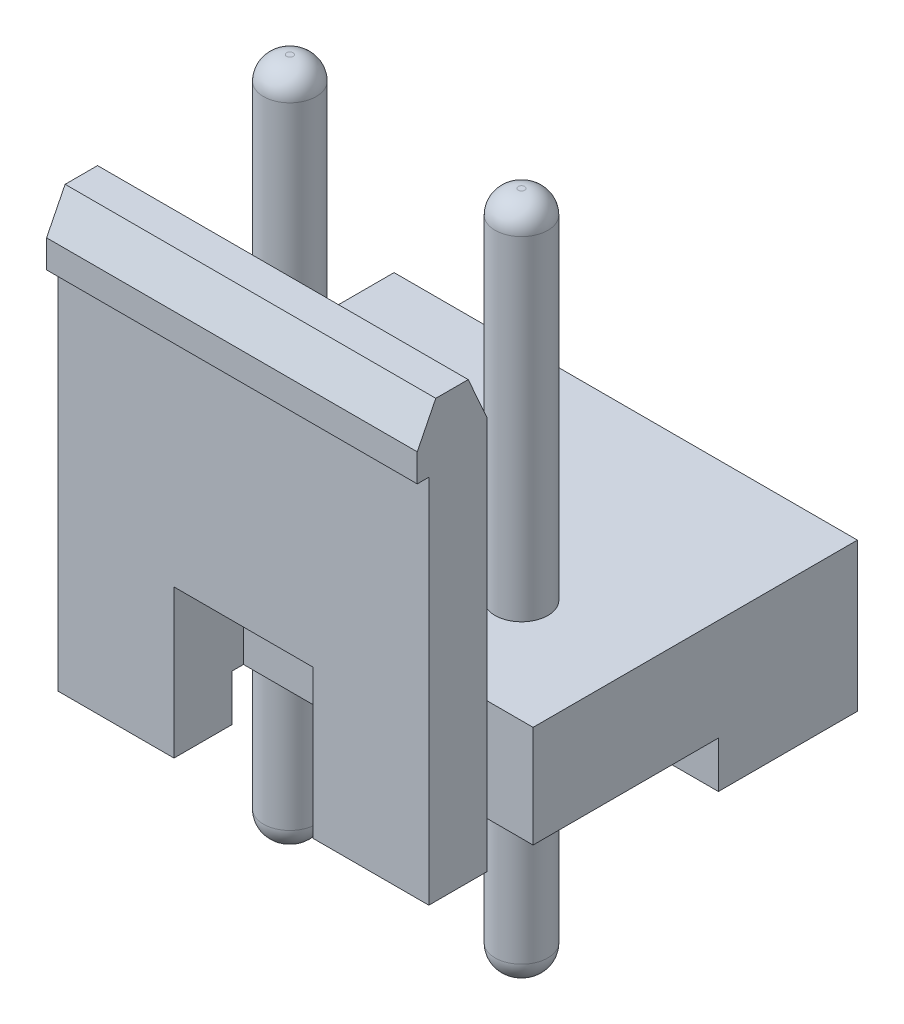
ISO-10303-21;
HEADER;
FILE_DESCRIPTION(('STEP AP214'),'2;1');
FILE_NAME('part.step','',(''),(''),'','','');
FILE_SCHEMA(('AUTOMOTIVE_DESIGN { 1 0 10303 214 1 1 1 1 }'));
ENDSEC;
DATA;
#1=APPLICATION_CONTEXT('core data for automotive mechanical design processes');
#2=APPLICATION_PROTOCOL_DEFINITION('international standard','automotive_design',2000,#1);
#3=PRODUCT_CONTEXT('',#1,'mechanical');
#4=PRODUCT('Part','Part','',(#3));
#5=PRODUCT_RELATED_PRODUCT_CATEGORY('part','',(#4));
#6=PRODUCT_DEFINITION_FORMATION('','',#4);
#7=PRODUCT_DEFINITION_CONTEXT('part definition',#1,'design');
#8=PRODUCT_DEFINITION('design','',#6,#7);
#9=PRODUCT_DEFINITION_SHAPE('','',#8);
#10=(LENGTH_UNIT() NAMED_UNIT(*) SI_UNIT(.MILLI.,.METRE.));
#11=(NAMED_UNIT(*) PLANE_ANGLE_UNIT() SI_UNIT($,.RADIAN.));
#12=(NAMED_UNIT(*) SI_UNIT($,.STERADIAN.) SOLID_ANGLE_UNIT());
#13=UNCERTAINTY_MEASURE_WITH_UNIT(LENGTH_MEASURE(1.E-05),#10,'distance_accuracy_value','');
#14=(GEOMETRIC_REPRESENTATION_CONTEXT(3) GLOBAL_UNCERTAINTY_ASSIGNED_CONTEXT((#13)) GLOBAL_UNIT_ASSIGNED_CONTEXT((#10,
#11,#12)) REPRESENTATION_CONTEXT('',''));
#15=CARTESIAN_POINT('',(0.,0.,0.));
#16=DIRECTION('',(0.,0.,1.));
#17=DIRECTION('',(1.,0.,0.));
#18=AXIS2_PLACEMENT_3D('',#15,#16,#17);
#19=CARTESIAN_POINT('',(5.,0.,2.75));
#20=DIRECTION('',(0.,0.,1.));
#21=DIRECTION('',(1.,0.,0.));
#22=AXIS2_PLACEMENT_3D('',#19,#20,#21);
#23=PLANE('',#22);
#24=DIRECTION('',(-1.,0.,0.));
#25=VECTOR('',#24,1.);
#26=CARTESIAN_POINT('',(5.,1.,2.75));
#27=LINE('',#26,#25);
#28=CARTESIAN_POINT('',(-1.5,1.,2.75));
#29=VERTEX_POINT('',#28);
#30=CARTESIAN_POINT('',(-4.,1.,2.75));
#31=VERTEX_POINT('',#30);
#32=EDGE_CURVE('E345',#29,#31,#27,.T.);
#33=ORIENTED_EDGE('',*,*,#32,.F.);
#34=DIRECTION('',(0.,1.,0.));
#35=VECTOR('',#34,1.);
#36=CARTESIAN_POINT('',(-1.5,0.,2.75));
#37=LINE('',#36,#35);
#38=CARTESIAN_POINT('',(-1.5,0.,2.75));
#39=VERTEX_POINT('',#38);
#40=EDGE_CURVE('E357',#39,#29,#37,.T.);
#41=ORIENTED_EDGE('',*,*,#40,.F.);
#42=DIRECTION('',(-1.,0.,0.));
#43=VECTOR('',#42,1.);
#44=CARTESIAN_POINT('',(5.,0.,2.75));
#45=LINE('',#44,#43);
#46=CARTESIAN_POINT('',(-4.,0.,2.75));
#47=VERTEX_POINT('',#46);
#48=EDGE_CURVE('E331',#39,#47,#45,.T.);
#49=ORIENTED_EDGE('',*,*,#48,.T.);
#50=DIRECTION('',(0.,1.,0.));
#51=VECTOR('',#50,1.);
#52=CARTESIAN_POINT('',(-4.,-5.4,2.75));
#53=LINE('',#52,#51);
#54=EDGE_CURVE('E256',#47,#31,#53,.T.);
#55=ORIENTED_EDGE('',*,*,#54,.T.);
#56=EDGE_LOOP('',(#33,#41,#49,#55));
#57=FACE_BOUND('',#56,.T.);
#58=ADVANCED_FACE('F45',(#57),#23,.F.);
#59=CARTESIAN_POINT('',(0.,0.,0.));
#60=DIRECTION('',(0.,1.,0.));
#61=DIRECTION('',(0.,0.,1.));
#62=AXIS2_PLACEMENT_3D('',#59,#60,#61);
#63=PLANE('',#62);
#64=DIRECTION('',(-1.,0.,0.));
#65=VECTOR('',#64,1.);
#66=CARTESIAN_POINT('',(5.,0.,4.));
#67=LINE('',#66,#65);
#68=CARTESIAN_POINT('',(-1.5,0.,4.));
#69=VERTEX_POINT('',#68);
#70=CARTESIAN_POINT('',(-4.,0.,4.));
#71=VERTEX_POINT('',#70);
#72=EDGE_CURVE('E393',#69,#71,#67,.T.);
#73=ORIENTED_EDGE('',*,*,#72,.T.);
#74=DIRECTION('',(0.,0.,-1.));
#75=VECTOR('',#74,1.);
#76=CARTESIAN_POINT('',(-4.,0.,0.));
#77=LINE('',#76,#75);
#78=EDGE_CURVE('E299',#71,#47,#77,.T.);
#79=ORIENTED_EDGE('',*,*,#78,.T.);
#80=ORIENTED_EDGE('',*,*,#48,.F.);
#81=DIRECTION('',(0.,0.,-1.));
#82=VECTOR('',#81,1.);
#83=CARTESIAN_POINT('',(-1.5,0.,5.75));
#84=LINE('',#83,#82);
#85=EDGE_CURVE('E373',#69,#39,#84,.T.);
#86=ORIENTED_EDGE('',*,*,#85,.F.);
#87=EDGE_LOOP('',(#73,#79,#80,#86));
#88=FACE_BOUND('',#87,.T.);
#89=ADVANCED_FACE('F649',(#88),#63,.F.);
#90=CARTESIAN_POINT('',(4.,0.,2.75));
#91=VERTEX_POINT('',#90);
#92=CARTESIAN_POINT('',(1.5,0.,2.75));
#93=VERTEX_POINT('',#92);
#94=EDGE_CURVE('E327',#91,#93,#45,.T.);
#95=ORIENTED_EDGE('',*,*,#94,.F.);
#96=DIRECTION('',(0.,0.,1.));
#97=VECTOR('',#96,1.);
#98=CARTESIAN_POINT('',(4.,0.,0.));
#99=LINE('',#98,#97);
#100=CARTESIAN_POINT('',(4.,0.,4.));
#101=VERTEX_POINT('',#100);
#102=EDGE_CURVE('E289',#91,#101,#99,.T.);
#103=ORIENTED_EDGE('',*,*,#102,.T.);
#104=CARTESIAN_POINT('',(1.5,0.,4.));
#105=VERTEX_POINT('',#104);
#106=EDGE_CURVE('E389',#101,#105,#67,.T.);
#107=ORIENTED_EDGE('',*,*,#106,.T.);
#108=DIRECTION('',(0.,0.,-1.));
#109=VECTOR('',#108,1.);
#110=CARTESIAN_POINT('',(1.5,0.,5.75));
#111=LINE('',#110,#109);
#112=EDGE_CURVE('E379',#105,#93,#111,.T.);
#113=ORIENTED_EDGE('',*,*,#112,.T.);
#114=EDGE_LOOP('',(#95,#103,#107,#113));
#115=FACE_BOUND('',#114,.T.);
#116=ADVANCED_FACE('F621',(#115),#63,.F.);
#117=CARTESIAN_POINT('',(-1.5,0.,5.75));
#118=DIRECTION('',(-1.,0.,0.));
#119=DIRECTION('',(0.,-1.,0.));
#120=AXIS2_PLACEMENT_3D('',#117,#118,#119);
#121=PLANE('',#120);
#122=ORIENTED_EDGE('',*,*,#85,.T.);
#123=ORIENTED_EDGE('',*,*,#40,.T.);
#124=DIRECTION('',(0.,0.,1.));
#125=VECTOR('',#124,1.);
#126=CARTESIAN_POINT('',(-1.5,1.,2.75));
#127=LINE('',#126,#125);
#128=CARTESIAN_POINT('',(-1.5,1.,2.5));
#129=VERTEX_POINT('',#128);
#130=EDGE_CURVE('E11',#129,#29,#127,.T.);
#131=ORIENTED_EDGE('',*,*,#130,.F.);
#132=DIRECTION('',(0.,-1.,0.));
#133=VECTOR('',#132,1.);
#134=CARTESIAN_POINT('',(-1.5,0.,2.5));
#135=LINE('',#134,#133);
#136=CARTESIAN_POINT('',(-1.5,3.2,2.5));
#137=VERTEX_POINT('',#136);
#138=EDGE_CURVE('E510',#137,#129,#135,.T.);
#139=ORIENTED_EDGE('',*,*,#138,.F.);
#140=DIRECTION('',(0.,0.,1.));
#141=VECTOR('',#140,1.);
#142=CARTESIAN_POINT('',(-1.5,3.2,2.5));
#143=LINE('',#142,#141);
#144=CARTESIAN_POINT('',(-1.5,3.2,2.75));
#145=VERTEX_POINT('',#144);
#146=EDGE_CURVE('E524',#137,#145,#143,.T.);
#147=ORIENTED_EDGE('',*,*,#146,.T.);
#148=CARTESIAN_POINT('',(-1.5,3.2,4.));
#149=VERTEX_POINT('',#148);
#150=EDGE_CURVE('E528',#145,#149,#143,.T.);
#151=ORIENTED_EDGE('',*,*,#150,.T.);
#152=DIRECTION('',(0.,1.,0.));
#153=VECTOR('',#152,1.);
#154=CARTESIAN_POINT('',(-1.5,0.,4.));
#155=LINE('',#154,#153);
#156=EDGE_CURVE('E439',#69,#149,#155,.T.);
#157=ORIENTED_EDGE('',*,*,#156,.F.);
#158=EDGE_LOOP('',(#122,#123,#131,#139,#147,#151,#157));
#159=FACE_BOUND('',#158,.T.);
#160=ADVANCED_FACE('F645',(#159),#121,.F.);
#161=CARTESIAN_POINT('',(1.5,0.,5.75));
#162=DIRECTION('',(1.,0.,0.));
#163=DIRECTION('',(0.,1.,0.));
#164=AXIS2_PLACEMENT_3D('',#161,#162,#163);
#165=PLANE('',#164);
#166=DIRECTION('',(0.,-1.,0.));
#167=VECTOR('',#166,1.);
#168=CARTESIAN_POINT('',(1.5,0.,4.));
#169=LINE('',#168,#167);
#170=CARTESIAN_POINT('',(1.5,3.2,4.));
#171=VERTEX_POINT('',#170);
#172=EDGE_CURVE('E435',#171,#105,#169,.T.);
#173=ORIENTED_EDGE('',*,*,#172,.F.);
#174=DIRECTION('',(0.,0.,1.));
#175=VECTOR('',#174,1.);
#176=CARTESIAN_POINT('',(1.5,3.2,2.5));
#177=LINE('',#176,#175);
#178=CARTESIAN_POINT('',(1.5,3.2,2.75));
#179=VERTEX_POINT('',#178);
#180=EDGE_CURVE('E514',#179,#171,#177,.T.);
#181=ORIENTED_EDGE('',*,*,#180,.F.);
#182=CARTESIAN_POINT('',(1.5,3.2,2.5));
#183=VERTEX_POINT('',#182);
#184=EDGE_CURVE('E504',#183,#179,#177,.T.);
#185=ORIENTED_EDGE('',*,*,#184,.F.);
#186=DIRECTION('',(0.,1.,0.));
#187=VECTOR('',#186,1.);
#188=CARTESIAN_POINT('',(1.5,0.,2.5));
#189=LINE('',#188,#187);
#190=CARTESIAN_POINT('',(1.5,1.,2.5));
#191=VERTEX_POINT('',#190);
#192=EDGE_CURVE('E501',#191,#183,#189,.T.);
#193=ORIENTED_EDGE('',*,*,#192,.F.);
#194=DIRECTION('',(0.,0.,-1.));
#195=VECTOR('',#194,1.);
#196=CARTESIAN_POINT('',(1.5,1.,2.75));
#197=LINE('',#196,#195);
#198=CARTESIAN_POINT('',(1.5,1.,2.75));
#199=VERTEX_POINT('',#198);
#200=EDGE_CURVE('E54',#199,#191,#197,.T.);
#201=ORIENTED_EDGE('',*,*,#200,.F.);
#202=DIRECTION('',(0.,-1.,0.));
#203=VECTOR('',#202,1.);
#204=CARTESIAN_POINT('',(1.5,0.,2.75));
#205=LINE('',#204,#203);
#206=EDGE_CURVE('E353',#199,#93,#205,.T.);
#207=ORIENTED_EDGE('',*,*,#206,.T.);
#208=ORIENTED_EDGE('',*,*,#112,.F.);
#209=EDGE_LOOP('',(#173,#181,#185,#193,#201,#207,#208));
#210=FACE_BOUND('',#209,.T.);
#211=ADVANCED_FACE('F498',(#210),#165,.F.);
#212=CARTESIAN_POINT('',(-1.5,0.,-1.25));
#213=VERTEX_POINT('',#212);
#214=CARTESIAN_POINT('',(-1.5,0.,-4.25));
#215=VERTEX_POINT('',#214);
#216=EDGE_CURVE('E378',#213,#215,#84,.T.);
#217=ORIENTED_EDGE('',*,*,#216,.F.);
#218=DIRECTION('',(-1.,0.,0.));
#219=VECTOR('',#218,1.);
#220=CARTESIAN_POINT('',(5.,0.,-1.25));
#221=LINE('',#220,#219);
#222=CARTESIAN_POINT('',(-5.,0.,-1.25));
#223=VERTEX_POINT('',#222);
#224=EDGE_CURVE('E336',#213,#223,#221,.T.);
#225=ORIENTED_EDGE('',*,*,#224,.T.);
#226=DIRECTION('',(0.,0.,1.));
#227=VECTOR('',#226,1.);
#228=CARTESIAN_POINT('',(-5.,0.,4.25));
#229=LINE('',#228,#227);
#230=CARTESIAN_POINT('',(-5.,0.,-4.25));
#231=VERTEX_POINT('',#230);
#232=EDGE_CURVE('E415',#231,#223,#229,.T.);
#233=ORIENTED_EDGE('',*,*,#232,.F.);
#234=DIRECTION('',(-1.,0.,0.));
#235=VECTOR('',#234,1.);
#236=CARTESIAN_POINT('',(5.,0.,-4.25));
#237=LINE('',#236,#235);
#238=EDGE_CURVE('E422',#215,#231,#237,.T.);
#239=ORIENTED_EDGE('',*,*,#238,.F.);
#240=EDGE_LOOP('',(#217,#225,#233,#239));
#241=FACE_BOUND('',#240,.T.);
#242=ADVANCED_FACE('F588',(#241),#63,.F.);
#243=CARTESIAN_POINT('',(5.,9.4,-4.25));
#244=DIRECTION('',(0.,0.,1.));
#245=DIRECTION('',(1.,0.,0.));
#246=AXIS2_PLACEMENT_3D('',#243,#244,#245);
#247=PLANE('',#246);
#248=DIRECTION('',(1.,0.,0.));
#249=VECTOR('',#248,1.);
#250=CARTESIAN_POINT('',(1.5,0.5,-4.25));
#251=LINE('',#250,#249);
#252=CARTESIAN_POINT('',(-1.5,0.5,-4.25));
#253=VERTEX_POINT('',#252);
#254=CARTESIAN_POINT('',(1.5,0.5,-4.25));
#255=VERTEX_POINT('',#254);
#256=EDGE_CURVE('E364',#253,#255,#251,.T.);
#257=ORIENTED_EDGE('',*,*,#256,.F.);
#258=DIRECTION('',(0.,1.,0.));
#259=VECTOR('',#258,1.);
#260=CARTESIAN_POINT('',(-1.5,0.,-4.25));
#261=LINE('',#260,#259);
#262=EDGE_CURVE('E360',#215,#253,#261,.T.);
#263=ORIENTED_EDGE('',*,*,#262,.F.);
#264=ORIENTED_EDGE('',*,*,#238,.T.);
#265=DIRECTION('',(0.,-1.,0.));
#266=VECTOR('',#265,1.);
#267=CARTESIAN_POINT('',(-5.,9.4,-4.25));
#268=LINE('',#267,#266);
#269=CARTESIAN_POINT('',(-5.,3.2,-4.25));
#270=VERTEX_POINT('',#269);
#271=EDGE_CURVE('E427',#270,#231,#268,.T.);
#272=ORIENTED_EDGE('',*,*,#271,.F.);
#273=DIRECTION('',(-1.,0.,0.));
#274=VECTOR('',#273,1.);
#275=CARTESIAN_POINT('',(-5.,3.2,-4.25));
#276=LINE('',#275,#274);
#277=CARTESIAN_POINT('',(5.,3.2,-4.25));
#278=VERTEX_POINT('',#277);
#279=EDGE_CURVE('E412',#278,#270,#276,.T.);
#280=ORIENTED_EDGE('',*,*,#279,.F.);
#281=DIRECTION('',(0.,-1.,0.));
#282=VECTOR('',#281,1.);
#283=CARTESIAN_POINT('',(5.,9.4,-4.25));
#284=LINE('',#283,#282);
#285=CARTESIAN_POINT('',(5.,0.,-4.25));
#286=VERTEX_POINT('',#285);
#287=EDGE_CURVE('E431',#278,#286,#284,.T.);
#288=ORIENTED_EDGE('',*,*,#287,.T.);
#289=CARTESIAN_POINT('',(1.5,0.,-4.25));
#290=VERTEX_POINT('',#289);
#291=EDGE_CURVE('E423',#286,#290,#237,.T.);
#292=ORIENTED_EDGE('',*,*,#291,.T.);
#293=DIRECTION('',(0.,-1.,0.));
#294=VECTOR('',#293,1.);
#295=CARTESIAN_POINT('',(1.5,0.,-4.25));
#296=LINE('',#295,#294);
#297=EDGE_CURVE('E368',#255,#290,#296,.T.);
#298=ORIENTED_EDGE('',*,*,#297,.F.);
#299=EDGE_LOOP('',(#257,#263,#264,#272,#280,#288,#292,#298));
#300=FACE_BOUND('',#299,.T.);
#301=ADVANCED_FACE('F566',(#300),#247,.F.);
#302=CARTESIAN_POINT('',(-5.,9.4,4.25));
#303=DIRECTION('',(1.,0.,0.));
#304=DIRECTION('',(0.,0.,-1.));
#305=AXIS2_PLACEMENT_3D('',#302,#303,#304);
#306=PLANE('',#305);
#307=DIRECTION('',(0.,0.,-1.));
#308=VECTOR('',#307,1.);
#309=CARTESIAN_POINT('',(-5.,1.,2.75));
#310=LINE('',#309,#308);
#311=CARTESIAN_POINT('',(-5.,1.,2.75));
#312=VERTEX_POINT('',#311);
#313=CARTESIAN_POINT('',(-5.,1.,-1.25));
#314=VERTEX_POINT('',#313);
#315=EDGE_CURVE('E311',#312,#314,#310,.T.);
#316=ORIENTED_EDGE('',*,*,#315,.F.);
#317=DIRECTION('',(0.,1.,0.));
#318=VECTOR('',#317,1.);
#319=CARTESIAN_POINT('',(-5.,-5.4,2.75));
#320=LINE('',#319,#318);
#321=CARTESIAN_POINT('',(-5.,3.2,2.75));
#322=VERTEX_POINT('',#321);
#323=EDGE_CURVE('E281',#312,#322,#320,.T.);
#324=ORIENTED_EDGE('',*,*,#323,.T.);
#325=DIRECTION('',(0.,0.,1.));
#326=VECTOR('',#325,1.);
#327=CARTESIAN_POINT('',(-5.,3.2,-4.25));
#328=LINE('',#327,#326);
#329=EDGE_CURVE('E392',#270,#322,#328,.T.);
#330=ORIENTED_EDGE('',*,*,#329,.F.);
#331=ORIENTED_EDGE('',*,*,#271,.T.);
#332=ORIENTED_EDGE('',*,*,#232,.T.);
#333=DIRECTION('',(0.,-1.,0.));
#334=VECTOR('',#333,1.);
#335=CARTESIAN_POINT('',(-5.,0.,-1.25));
#336=LINE('',#335,#334);
#337=EDGE_CURVE('E317',#314,#223,#336,.T.);
#338=ORIENTED_EDGE('',*,*,#337,.F.);
#339=EDGE_LOOP('',(#316,#324,#330,#331,#332,#338));
#340=FACE_BOUND('',#339,.T.);
#341=ADVANCED_FACE('F562',(#340),#306,.F.);
#342=CARTESIAN_POINT('',(5.,9.4,4.25));
#343=DIRECTION('',(0.,0.,-1.));
#344=DIRECTION('',(-1.,0.,0.));
#345=AXIS2_PLACEMENT_3D('',#342,#343,#344);
#346=PLANE('',#345);
#347=DIRECTION('',(0.,1.,0.));
#348=VECTOR('',#347,1.);
#349=CARTESIAN_POINT('',(4.,-5.4,4.25));
#350=LINE('',#349,#348);
#351=CARTESIAN_POINT('',(4.,8.,4.25));
#352=VERTEX_POINT('',#351);
#353=CARTESIAN_POINT('',(4.,8.6,4.25));
#354=VERTEX_POINT('',#353);
#355=EDGE_CURVE('E241',#352,#354,#350,.T.);
#356=ORIENTED_EDGE('',*,*,#355,.T.);
#357=DIRECTION('',(-1.,0.,0.));
#358=VECTOR('',#357,1.);
#359=CARTESIAN_POINT('',(6.,8.6,4.25));
#360=LINE('',#359,#358);
#361=CARTESIAN_POINT('',(-4.,8.6,4.25));
#362=VERTEX_POINT('',#361);
#363=EDGE_CURVE('E225',#354,#362,#360,.T.);
#364=ORIENTED_EDGE('',*,*,#363,.T.);
#365=DIRECTION('',(0.,1.,0.));
#366=VECTOR('',#365,1.);
#367=CARTESIAN_POINT('',(-4.,-5.4,4.25));
#368=LINE('',#367,#366);
#369=CARTESIAN_POINT('',(-4.,8.,4.25));
#370=VERTEX_POINT('',#369);
#371=EDGE_CURVE('E239',#370,#362,#368,.T.);
#372=ORIENTED_EDGE('',*,*,#371,.F.);
#373=DIRECTION('',(-1.,0.,0.));
#374=VECTOR('',#373,1.);
#375=CARTESIAN_POINT('',(5.,8.,4.25));
#376=LINE('',#375,#374);
#377=EDGE_CURVE('E377',#352,#370,#376,.T.);
#378=ORIENTED_EDGE('',*,*,#377,.F.);
#379=EDGE_LOOP('',(#356,#364,#372,#378));
#380=FACE_BOUND('',#379,.T.);
#381=ADVANCED_FACE('F237',(#380),#346,.F.);
#382=CARTESIAN_POINT('',(5.,9.4,4.25));
#383=DIRECTION('',(-1.,0.,0.));
#384=DIRECTION('',(0.,0.,1.));
#385=AXIS2_PLACEMENT_3D('',#382,#383,#384);
#386=PLANE('',#385);
#387=DIRECTION('',(0.,0.,-1.));
#388=VECTOR('',#387,1.);
#389=CARTESIAN_POINT('',(5.,3.2,-4.25));
#390=LINE('',#389,#388);
#391=CARTESIAN_POINT('',(5.,3.2,2.75));
#392=VERTEX_POINT('',#391);
#393=EDGE_CURVE('E408',#392,#278,#390,.T.);
#394=ORIENTED_EDGE('',*,*,#393,.F.);
#395=DIRECTION('',(0.,1.,0.));
#396=VECTOR('',#395,1.);
#397=CARTESIAN_POINT('',(5.,-5.4,2.75));
#398=LINE('',#397,#396);
#399=CARTESIAN_POINT('',(5.,1.,2.75));
#400=VERTEX_POINT('',#399);
#401=EDGE_CURVE('E261',#400,#392,#398,.T.);
#402=ORIENTED_EDGE('',*,*,#401,.F.);
#403=DIRECTION('',(0.,0.,-1.));
#404=VECTOR('',#403,1.);
#405=CARTESIAN_POINT('',(5.,1.,2.75));
#406=LINE('',#405,#404);
#407=CARTESIAN_POINT('',(5.,1.,-1.25));
#408=VERTEX_POINT('',#407);
#409=EDGE_CURVE('E312',#400,#408,#406,.T.);
#410=ORIENTED_EDGE('',*,*,#409,.T.);
#411=DIRECTION('',(0.,-1.,0.));
#412=VECTOR('',#411,1.);
#413=CARTESIAN_POINT('',(5.,0.,-1.25));
#414=LINE('',#413,#412);
#415=CARTESIAN_POINT('',(5.,0.,-1.25));
#416=VERTEX_POINT('',#415);
#417=EDGE_CURVE('E316',#408,#416,#414,.T.);
#418=ORIENTED_EDGE('',*,*,#417,.T.);
#419=DIRECTION('',(0.,0.,-1.));
#420=VECTOR('',#419,1.);
#421=CARTESIAN_POINT('',(5.,0.,4.25));
#422=LINE('',#421,#420);
#423=EDGE_CURVE('E419',#416,#286,#422,.T.);
#424=ORIENTED_EDGE('',*,*,#423,.T.);
#425=ORIENTED_EDGE('',*,*,#287,.F.);
#426=EDGE_LOOP('',(#394,#402,#410,#418,#424,#425));
#427=FACE_BOUND('',#426,.T.);
#428=ADVANCED_FACE('F605',(#427),#386,.F.);
#429=CARTESIAN_POINT('',(0.,9.4,0.));
#430=DIRECTION('',(0.,1.,0.));
#431=DIRECTION('',(0.,0.,1.));
#432=AXIS2_PLACEMENT_3D('',#429,#430,#431);
#433=PLANE('',#432);
#434=DIRECTION('',(-1.,0.,0.));
#435=VECTOR('',#434,1.);
#436=CARTESIAN_POINT('',(6.,9.4,3.85));
#437=LINE('',#436,#435);
#438=CARTESIAN_POINT('',(4.,9.4,3.85));
#439=VERTEX_POINT('',#438);
#440=CARTESIAN_POINT('',(-4.,9.4,3.85));
#441=VERTEX_POINT('',#440);
#442=EDGE_CURVE('E69',#439,#441,#437,.T.);
#443=ORIENTED_EDGE('',*,*,#442,.F.);
#444=DIRECTION('',(0.,0.,1.));
#445=VECTOR('',#444,1.);
#446=CARTESIAN_POINT('',(4.,9.4,4.25));
#447=LINE('',#446,#445);
#448=CARTESIAN_POINT('',(4.,9.4,3.15));
#449=VERTEX_POINT('',#448);
#450=EDGE_CURVE('E257',#449,#439,#447,.T.);
#451=ORIENTED_EDGE('',*,*,#450,.F.);
#452=DIRECTION('',(-1.,0.,0.));
#453=VECTOR('',#452,1.);
#454=CARTESIAN_POINT('',(6.,9.4,3.15));
#455=LINE('',#454,#453);
#456=CARTESIAN_POINT('',(-4.,9.4,3.15));
#457=VERTEX_POINT('',#456);
#458=EDGE_CURVE('E1119',#449,#457,#455,.T.);
#459=ORIENTED_EDGE('',*,*,#458,.T.);
#460=DIRECTION('',(0.,0.,-1.));
#461=VECTOR('',#460,1.);
#462=CARTESIAN_POINT('',(-4.,9.4,4.25));
#463=LINE('',#462,#461);
#464=EDGE_CURVE('E249',#441,#457,#463,.T.);
#465=ORIENTED_EDGE('',*,*,#464,.F.);
#466=EDGE_LOOP('',(#443,#451,#459,#465));
#467=FACE_BOUND('',#466,.T.);
#468=ADVANCED_FACE('F762',(#467),#433,.T.);
#469=ORIENTED_EDGE('',*,*,#423,.F.);
#470=CARTESIAN_POINT('',(1.5,0.,-1.25));
#471=VERTEX_POINT('',#470);
#472=EDGE_CURVE('E332',#416,#471,#221,.T.);
#473=ORIENTED_EDGE('',*,*,#472,.T.);
#474=EDGE_CURVE('E383',#471,#290,#111,.T.);
#475=ORIENTED_EDGE('',*,*,#474,.T.);
#476=ORIENTED_EDGE('',*,*,#291,.F.);
#477=EDGE_LOOP('',(#469,#473,#475,#476));
#478=FACE_BOUND('',#477,.T.);
#479=ADVANCED_FACE('F601',(#478),#63,.F.);
#480=CARTESIAN_POINT('',(-5.,3.2,2.75));
#481=DIRECTION('',(0.,0.,1.));
#482=DIRECTION('',(0.,-1.,0.));
#483=AXIS2_PLACEMENT_3D('',#480,#481,#482);
#484=PLANE('',#483);
#485=CARTESIAN_POINT('',(-4.,3.2,2.75));
#486=VERTEX_POINT('',#485);
#487=CARTESIAN_POINT('',(-4.,8.5,2.75));
#488=VERTEX_POINT('',#487);
#489=EDGE_CURVE('E248',#486,#488,#53,.T.);
#490=ORIENTED_EDGE('',*,*,#489,.T.);
#491=DIRECTION('',(-1.,0.,0.));
#492=VECTOR('',#491,1.);
#493=CARTESIAN_POINT('',(6.,8.5,2.75));
#494=LINE('',#493,#492);
#495=CARTESIAN_POINT('',(4.,8.5,2.75));
#496=VERTEX_POINT('',#495);
#497=EDGE_CURVE('E61',#496,#488,#494,.T.);
#498=ORIENTED_EDGE('',*,*,#497,.F.);
#499=DIRECTION('',(0.,1.,0.));
#500=VECTOR('',#499,1.);
#501=CARTESIAN_POINT('',(4.,-5.4,2.75));
#502=LINE('',#501,#500);
#503=CARTESIAN_POINT('',(4.,3.2,2.75));
#504=VERTEX_POINT('',#503);
#505=EDGE_CURVE('E265',#504,#496,#502,.T.);
#506=ORIENTED_EDGE('',*,*,#505,.F.);
#507=DIRECTION('',(1.,0.,0.));
#508=VECTOR('',#507,1.);
#509=CARTESIAN_POINT('',(-5.,3.2,2.75));
#510=LINE('',#509,#508);
#511=EDGE_CURVE('E403',#179,#504,#510,.T.);
#512=ORIENTED_EDGE('',*,*,#511,.F.);
#513=DIRECTION('',(-1.,0.,0.));
#514=VECTOR('',#513,1.);
#515=CARTESIAN_POINT('',(-5.,3.2,2.75));
#516=LINE('',#515,#514);
#517=EDGE_CURVE('E272',#179,#145,#516,.T.);
#518=ORIENTED_EDGE('',*,*,#517,.T.);
#519=EDGE_CURVE('E409',#486,#145,#510,.T.);
#520=ORIENTED_EDGE('',*,*,#519,.F.);
#521=EDGE_LOOP('',(#490,#498,#506,#512,#518,#520));
#522=FACE_BOUND('',#521,.T.);
#523=ADVANCED_FACE('F553',(#522),#484,.F.);
#524=CARTESIAN_POINT('',(0.,3.2,0.));
#525=DIRECTION('',(0.,1.,0.));
#526=DIRECTION('',(0.,0.,1.));
#527=AXIS2_PLACEMENT_3D('',#524,#525,#526);
#528=PLANE('',#527);
#529=ORIENTED_EDGE('',*,*,#146,.F.);
#530=DIRECTION('',(-1.,0.,0.));
#531=VECTOR('',#530,1.);
#532=CARTESIAN_POINT('',(-1.5,3.2,2.5));
#533=LINE('',#532,#531);
#534=EDGE_CURVE('E509',#183,#137,#533,.T.);
#535=ORIENTED_EDGE('',*,*,#534,.F.);
#536=ORIENTED_EDGE('',*,*,#184,.T.);
#537=ORIENTED_EDGE('',*,*,#511,.T.);
#538=DIRECTION('',(-1.,0.,0.));
#539=VECTOR('',#538,1.);
#540=CARTESIAN_POINT('',(0.,3.2,2.75));
#541=LINE('',#540,#539);
#542=EDGE_CURVE('E276',#392,#504,#541,.T.);
#543=ORIENTED_EDGE('',*,*,#542,.F.);
#544=ORIENTED_EDGE('',*,*,#393,.T.);
#545=ORIENTED_EDGE('',*,*,#279,.T.);
#546=ORIENTED_EDGE('',*,*,#329,.T.);
#547=EDGE_CURVE('E404',#322,#486,#510,.T.);
#548=ORIENTED_EDGE('',*,*,#547,.T.);
#549=ORIENTED_EDGE('',*,*,#519,.T.);
#550=EDGE_LOOP('',(#529,#535,#536,#537,#543,#544,#545,#546,#548,#549));
#551=FACE_BOUND('',#550,.T.);
#552=CARTESIAN_POINT('',(2.5,3.2,0.5));
#553=DIRECTION('',(0.,1.,0.));
#554=DIRECTION('',(0.,0.,1.));
#555=AXIS2_PLACEMENT_3D('',#552,#553,#554);
#556=CIRCLE('',#555,0.57);
#557=CARTESIAN_POINT('',(2.5,3.2,1.07));
#558=VERTEX_POINT('',#557);
#559=EDGE_CURVE('E303',#558,#558,#556,.F.);
#560=ORIENTED_EDGE('',*,*,#559,.T.);
#561=EDGE_LOOP('',(#560));
#562=FACE_BOUND('',#561,.T.);
#563=CARTESIAN_POINT('',(-2.5,3.2,0.5));
#564=DIRECTION('',(0.,1.,0.));
#565=DIRECTION('',(0.,0.,1.));
#566=AXIS2_PLACEMENT_3D('',#563,#564,#565);
#567=CIRCLE('',#566,0.57);
#568=CARTESIAN_POINT('',(-2.5,3.2,1.07));
#569=VERTEX_POINT('',#568);
#570=EDGE_CURVE('E307',#569,#569,#567,.F.);
#571=ORIENTED_EDGE('',*,*,#570,.T.);
#572=EDGE_LOOP('',(#571));
#573=FACE_BOUND('',#572,.T.);
#574=ADVANCED_FACE('F558',(#551,#562,#573),#528,.T.);
#575=CARTESIAN_POINT('',(5.,0.,4.));
#576=DIRECTION('',(0.,0.,-1.));
#577=DIRECTION('',(-1.,0.,0.));
#578=AXIS2_PLACEMENT_3D('',#575,#576,#577);
#579=PLANE('',#578);
#580=ORIENTED_EDGE('',*,*,#156,.T.);
#581=DIRECTION('',(-1.,0.,0.));
#582=VECTOR('',#581,1.);
#583=CARTESIAN_POINT('',(-1.5,3.2,4.));
#584=LINE('',#583,#582);
#585=EDGE_CURVE('E516',#171,#149,#584,.T.);
#586=ORIENTED_EDGE('',*,*,#585,.F.);
#587=ORIENTED_EDGE('',*,*,#172,.T.);
#588=ORIENTED_EDGE('',*,*,#106,.F.);
#589=DIRECTION('',(0.,1.,0.));
#590=VECTOR('',#589,1.);
#591=CARTESIAN_POINT('',(4.,0.,4.));
#592=LINE('',#591,#590);
#593=CARTESIAN_POINT('',(4.,8.,4.));
#594=VERTEX_POINT('',#593);
#595=EDGE_CURVE('E285',#101,#594,#592,.T.);
#596=ORIENTED_EDGE('',*,*,#595,.T.);
#597=DIRECTION('',(-1.,0.,0.));
#598=VECTOR('',#597,1.);
#599=CARTESIAN_POINT('',(5.,8.,4.));
#600=LINE('',#599,#598);
#601=CARTESIAN_POINT('',(-4.,8.,4.));
#602=VERTEX_POINT('',#601);
#603=EDGE_CURVE('E394',#594,#602,#600,.T.);
#604=ORIENTED_EDGE('',*,*,#603,.T.);
#605=DIRECTION('',(0.,-1.,0.));
#606=VECTOR('',#605,1.);
#607=CARTESIAN_POINT('',(-4.,0.,4.));
#608=LINE('',#607,#606);
#609=EDGE_CURVE('E295',#602,#71,#608,.T.);
#610=ORIENTED_EDGE('',*,*,#609,.T.);
#611=ORIENTED_EDGE('',*,*,#72,.F.);
#612=EDGE_LOOP('',(#580,#586,#587,#588,#596,#604,#610,#611));
#613=FACE_BOUND('',#612,.T.);
#614=ADVANCED_FACE('F626',(#613),#579,.F.);
#615=CARTESIAN_POINT('',(5.,8.,4.25));
#616=DIRECTION('',(0.,1.,0.));
#617=DIRECTION('',(0.,0.,1.));
#618=AXIS2_PLACEMENT_3D('',#615,#616,#617);
#619=PLANE('',#618);
#620=ORIENTED_EDGE('',*,*,#377,.T.);
#621=DIRECTION('',(0.,0.,-1.));
#622=VECTOR('',#621,1.);
#623=CARTESIAN_POINT('',(-4.,8.,4.25));
#624=LINE('',#623,#622);
#625=EDGE_CURVE('E246',#370,#602,#624,.T.);
#626=ORIENTED_EDGE('',*,*,#625,.T.);
#627=ORIENTED_EDGE('',*,*,#603,.F.);
#628=DIRECTION('',(0.,0.,1.));
#629=VECTOR('',#628,1.);
#630=CARTESIAN_POINT('',(4.,8.,4.25));
#631=LINE('',#630,#629);
#632=EDGE_CURVE('E280',#594,#352,#631,.T.);
#633=ORIENTED_EDGE('',*,*,#632,.T.);
#634=EDGE_LOOP('',(#620,#626,#627,#633));
#635=FACE_BOUND('',#634,.T.);
#636=ADVANCED_FACE('F637',(#635),#619,.F.);
#637=DIRECTION('',(0.,0.,-1.));
#638=VECTOR('',#637,1.);
#639=CARTESIAN_POINT('',(-1.5,0.5,5.75));
#640=LINE('',#639,#638);
#641=CARTESIAN_POINT('',(-1.5,0.5,-1.25));
#642=VERTEX_POINT('',#641);
#643=EDGE_CURVE('E372',#642,#253,#640,.T.);
#644=ORIENTED_EDGE('',*,*,#643,.F.);
#645=DIRECTION('',(0.,-1.,0.));
#646=VECTOR('',#645,1.);
#647=CARTESIAN_POINT('',(-1.5,0.,-1.25));
#648=LINE('',#647,#646);
#649=EDGE_CURVE('E349',#642,#213,#648,.T.);
#650=ORIENTED_EDGE('',*,*,#649,.T.);
#651=ORIENTED_EDGE('',*,*,#216,.T.);
#652=ORIENTED_EDGE('',*,*,#262,.T.);
#653=EDGE_LOOP('',(#644,#650,#651,#652));
#654=FACE_BOUND('',#653,.T.);
#655=ADVANCED_FACE('F591',(#654),#121,.F.);
#656=ORIENTED_EDGE('',*,*,#474,.F.);
#657=DIRECTION('',(0.,1.,0.));
#658=VECTOR('',#657,1.);
#659=CARTESIAN_POINT('',(1.5,0.,-1.25));
#660=LINE('',#659,#658);
#661=CARTESIAN_POINT('',(1.5,0.5,-1.25));
#662=VERTEX_POINT('',#661);
#663=EDGE_CURVE('E330',#471,#662,#660,.T.);
#664=ORIENTED_EDGE('',*,*,#663,.T.);
#665=DIRECTION('',(0.,0.,-1.));
#666=VECTOR('',#665,1.);
#667=CARTESIAN_POINT('',(1.5,0.5,5.75));
#668=LINE('',#667,#666);
#669=EDGE_CURVE('E384',#662,#255,#668,.T.);
#670=ORIENTED_EDGE('',*,*,#669,.T.);
#671=ORIENTED_EDGE('',*,*,#297,.T.);
#672=EDGE_LOOP('',(#656,#664,#670,#671));
#673=FACE_BOUND('',#672,.T.);
#674=ADVANCED_FACE('F598',(#673),#165,.F.);
#675=CARTESIAN_POINT('',(1.5,0.5,5.75));
#676=DIRECTION('',(0.,1.,0.));
#677=DIRECTION('',(0.,0.,1.));
#678=AXIS2_PLACEMENT_3D('',#675,#676,#677);
#679=PLANE('',#678);
#680=ORIENTED_EDGE('',*,*,#669,.F.);
#681=DIRECTION('',(-1.,0.,0.));
#682=VECTOR('',#681,1.);
#683=CARTESIAN_POINT('',(1.5,0.5,-1.25));
#684=LINE('',#683,#682);
#685=EDGE_CURVE('E442',#662,#642,#684,.T.);
#686=ORIENTED_EDGE('',*,*,#685,.T.);
#687=ORIENTED_EDGE('',*,*,#643,.T.);
#688=ORIENTED_EDGE('',*,*,#256,.T.);
#689=EDGE_LOOP('',(#680,#686,#687,#688));
#690=FACE_BOUND('',#689,.T.);
#691=ADVANCED_FACE('F594',(#690),#679,.F.);
#692=ORIENTED_EDGE('',*,*,#206,.F.);
#693=CARTESIAN_POINT('',(4.,1.,2.75));
#694=VERTEX_POINT('',#693);
#695=EDGE_CURVE('E344',#694,#199,#27,.T.);
#696=ORIENTED_EDGE('',*,*,#695,.F.);
#697=EDGE_CURVE('E264',#91,#694,#502,.T.);
#698=ORIENTED_EDGE('',*,*,#697,.F.);
#699=ORIENTED_EDGE('',*,*,#94,.T.);
#700=EDGE_LOOP('',(#692,#696,#698,#699));
#701=FACE_BOUND('',#700,.T.);
#702=ADVANCED_FACE('F618',(#701),#23,.F.);
#703=CARTESIAN_POINT('',(5.,0.,-1.25));
#704=DIRECTION('',(0.,0.,-1.));
#705=DIRECTION('',(-1.,0.,0.));
#706=AXIS2_PLACEMENT_3D('',#703,#704,#705);
#707=PLANE('',#706);
#708=ORIENTED_EDGE('',*,*,#685,.F.);
#709=ORIENTED_EDGE('',*,*,#663,.F.);
#710=ORIENTED_EDGE('',*,*,#472,.F.);
#711=ORIENTED_EDGE('',*,*,#417,.F.);
#712=DIRECTION('',(-1.,0.,0.));
#713=VECTOR('',#712,1.);
#714=CARTESIAN_POINT('',(5.,1.,-1.25));
#715=LINE('',#714,#713);
#716=EDGE_CURVE('E337',#408,#314,#715,.T.);
#717=ORIENTED_EDGE('',*,*,#716,.T.);
#718=ORIENTED_EDGE('',*,*,#337,.T.);
#719=ORIENTED_EDGE('',*,*,#224,.F.);
#720=ORIENTED_EDGE('',*,*,#649,.F.);
#721=EDGE_LOOP('',(#708,#709,#710,#711,#717,#718,#719,#720));
#722=FACE_BOUND('',#721,.T.);
#723=ADVANCED_FACE('F586',(#722),#707,.F.);
#724=CARTESIAN_POINT('',(5.,1.,2.75));
#725=DIRECTION('',(0.,1.,0.));
#726=DIRECTION('',(0.,0.,1.));
#727=AXIS2_PLACEMENT_3D('',#724,#725,#726);
#728=PLANE('',#727);
#729=CARTESIAN_POINT('',(2.5,1.,0.5));
#730=DIRECTION('',(0.,1.,0.));
#731=DIRECTION('',(0.,0.,1.));
#732=AXIS2_PLACEMENT_3D('',#729,#730,#731);
#733=CIRCLE('',#732,0.57);
#734=CARTESIAN_POINT('',(2.5,1.,1.07));
#735=VERTEX_POINT('',#734);
#736=EDGE_CURVE('E450',#735,#735,#733,.F.);
#737=ORIENTED_EDGE('',*,*,#736,.F.);
#738=EDGE_LOOP('',(#737));
#739=FACE_BOUND('',#738,.T.);
#740=CARTESIAN_POINT('',(-2.5,1.,0.5));
#741=DIRECTION('',(0.,1.,0.));
#742=DIRECTION('',(0.,0.,1.));
#743=AXIS2_PLACEMENT_3D('',#740,#741,#742);
#744=CIRCLE('',#743,0.57);
#745=CARTESIAN_POINT('',(-2.5,1.,1.07));
#746=VERTEX_POINT('',#745);
#747=EDGE_CURVE('E446',#746,#746,#744,.F.);
#748=ORIENTED_EDGE('',*,*,#747,.F.);
#749=EDGE_LOOP('',(#748));
#750=FACE_BOUND('',#749,.T.);
#751=DIRECTION('',(-1.,0.,0.));
#752=VECTOR('',#751,1.);
#753=CARTESIAN_POINT('',(5.,1.,2.5));
#754=LINE('',#753,#752);
#755=EDGE_CURVE('E486',#191,#129,#754,.T.);
#756=ORIENTED_EDGE('',*,*,#755,.T.);
#757=ORIENTED_EDGE('',*,*,#130,.T.);
#758=ORIENTED_EDGE('',*,*,#32,.T.);
#759=EDGE_CURVE('E321',#31,#312,#27,.T.);
#760=ORIENTED_EDGE('',*,*,#759,.T.);
#761=ORIENTED_EDGE('',*,*,#315,.T.);
#762=ORIENTED_EDGE('',*,*,#716,.F.);
#763=ORIENTED_EDGE('',*,*,#409,.F.);
#764=EDGE_CURVE('E340',#400,#694,#27,.T.);
#765=ORIENTED_EDGE('',*,*,#764,.T.);
#766=ORIENTED_EDGE('',*,*,#695,.T.);
#767=ORIENTED_EDGE('',*,*,#200,.T.);
#768=EDGE_LOOP('',(#756,#757,#758,#760,#761,#762,#763,#765,#766,#767));
#769=FACE_BOUND('',#768,.T.);
#770=ADVANCED_FACE('F494',(#739,#750,#769),#728,.F.);
#771=CARTESIAN_POINT('',(-2.5,-3.7,0.5));
#772=DIRECTION('',(0.,1.,0.));
#773=DIRECTION('',(0.,0.,1.));
#774=AXIS2_PLACEMENT_3D('',#771,#772,#773);
#775=PLANE('',#774);
#776=CARTESIAN_POINT('',(-2.5,-3.7,0.5));
#777=DIRECTION('',(0.,1.,0.));
#778=DIRECTION('',(0.,0.,1.));
#779=AXIS2_PLACEMENT_3D('',#776,#777,#778);
#780=CIRCLE('',#779,0.0699999999999999);
#781=CARTESIAN_POINT('',(-2.5,-3.7,0.57));
#782=VERTEX_POINT('',#781);
#783=EDGE_CURVE('E466',#782,#782,#780,.F.);
#784=ORIENTED_EDGE('',*,*,#783,.T.);
#785=EDGE_LOOP('',(#784));
#786=FACE_BOUND('',#785,.T.);
#787=ADVANCED_FACE('F721',(#786),#775,.F.);
#788=CARTESIAN_POINT('',(-2.5,10.9,0.5));
#789=DIRECTION('',(0.,-1.,0.));
#790=DIRECTION('',(0.,0.,-1.));
#791=AXIS2_PLACEMENT_3D('',#788,#789,#790);
#792=CYLINDRICAL_SURFACE('',#791,0.57);
#793=CARTESIAN_POINT('',(-2.5,-3.2,0.5));
#794=DIRECTION('',(0.,1.,0.));
#795=DIRECTION('',(0.,0.,1.));
#796=AXIS2_PLACEMENT_3D('',#793,#794,#795);
#797=CIRCLE('',#796,0.57);
#798=CARTESIAN_POINT('',(-2.5,-3.2,1.07));
#799=VERTEX_POINT('',#798);
#800=EDGE_CURVE('E462',#799,#799,#797,.T.);
#801=ORIENTED_EDGE('',*,*,#800,.T.);
#802=EDGE_LOOP('',(#801));
#803=FACE_BOUND('',#802,.T.);
#804=ORIENTED_EDGE('',*,*,#747,.T.);
#805=EDGE_LOOP('',(#804));
#806=FACE_BOUND('',#805,.T.);
#807=ADVANCED_FACE('F724',(#803,#806),#792,.T.);
#808=CARTESIAN_POINT('',(-2.5,10.4,0.5));
#809=DIRECTION('',(0.,1.,0.));
#810=DIRECTION('',(0.,0.,1.));
#811=AXIS2_PLACEMENT_3D('',#808,#809,#810);
#812=CIRCLE('',#811,0.57);
#813=CARTESIAN_POINT('',(-2.5,10.4,1.07));
#814=VERTEX_POINT('',#813);
#815=EDGE_CURVE('E474',#814,#814,#812,.F.);
#816=ORIENTED_EDGE('',*,*,#815,.T.);
#817=EDGE_LOOP('',(#816));
#818=FACE_BOUND('',#817,.T.);
#819=ORIENTED_EDGE('',*,*,#570,.F.);
#820=EDGE_LOOP('',(#819));
#821=FACE_BOUND('',#820,.T.);
#822=ADVANCED_FACE('F719',(#818,#821),#792,.T.);
#823=CARTESIAN_POINT('',(-2.5,10.9,0.5));
#824=DIRECTION('',(0.,1.,0.));
#825=DIRECTION('',(0.,0.,1.));
#826=AXIS2_PLACEMENT_3D('',#823,#824,#825);
#827=PLANE('',#826);
#828=CARTESIAN_POINT('',(-2.5,10.9,0.5));
#829=DIRECTION('',(0.,1.,0.));
#830=DIRECTION('',(0.,0.,1.));
#831=AXIS2_PLACEMENT_3D('',#828,#829,#830);
#832=CIRCLE('',#831,0.0699999999999999);
#833=CARTESIAN_POINT('',(-2.5,10.9,0.57));
#834=VERTEX_POINT('',#833);
#835=EDGE_CURVE('E470',#834,#834,#832,.T.);
#836=ORIENTED_EDGE('',*,*,#835,.T.);
#837=EDGE_LOOP('',(#836));
#838=FACE_BOUND('',#837,.T.);
#839=ADVANCED_FACE('F711',(#838),#827,.T.);
#840=CARTESIAN_POINT('',(2.5,-3.7,0.5));
#841=DIRECTION('',(0.,1.,0.));
#842=DIRECTION('',(0.,0.,1.));
#843=AXIS2_PLACEMENT_3D('',#840,#841,#842);
#844=PLANE('',#843);
#845=CARTESIAN_POINT('',(2.5,-3.7,0.5));
#846=DIRECTION('',(0.,1.,0.));
#847=DIRECTION('',(0.,0.,1.));
#848=AXIS2_PLACEMENT_3D('',#845,#846,#847);
#849=CIRCLE('',#848,0.0699999999999999);
#850=CARTESIAN_POINT('',(2.5,-3.7,0.57));
#851=VERTEX_POINT('',#850);
#852=EDGE_CURVE('E458',#851,#851,#849,.F.);
#853=ORIENTED_EDGE('',*,*,#852,.T.);
#854=EDGE_LOOP('',(#853));
#855=FACE_BOUND('',#854,.T.);
#856=ADVANCED_FACE('F708',(#855),#844,.F.);
#857=CARTESIAN_POINT('',(2.5,10.9,0.5));
#858=DIRECTION('',(0.,-1.,0.));
#859=DIRECTION('',(0.,0.,-1.));
#860=AXIS2_PLACEMENT_3D('',#857,#858,#859);
#861=CYLINDRICAL_SURFACE('',#860,0.57);
#862=CARTESIAN_POINT('',(2.5,-3.2,0.5));
#863=DIRECTION('',(0.,1.,0.));
#864=DIRECTION('',(0.,0.,1.));
#865=AXIS2_PLACEMENT_3D('',#862,#863,#864);
#866=CIRCLE('',#865,0.57);
#867=CARTESIAN_POINT('',(2.5,-3.2,1.07));
#868=VERTEX_POINT('',#867);
#869=EDGE_CURVE('E454',#868,#868,#866,.T.);
#870=ORIENTED_EDGE('',*,*,#869,.T.);
#871=EDGE_LOOP('',(#870));
#872=FACE_BOUND('',#871,.T.);
#873=ORIENTED_EDGE('',*,*,#736,.T.);
#874=EDGE_LOOP('',(#873));
#875=FACE_BOUND('',#874,.T.);
#876=ADVANCED_FACE('F706',(#872,#875),#861,.T.);
#877=CARTESIAN_POINT('',(2.5,10.4,0.5));
#878=DIRECTION('',(0.,1.,0.));
#879=DIRECTION('',(0.,0.,1.));
#880=AXIS2_PLACEMENT_3D('',#877,#878,#879);
#881=CIRCLE('',#880,0.57);
#882=CARTESIAN_POINT('',(2.5,10.4,1.07));
#883=VERTEX_POINT('',#882);
#884=EDGE_CURVE('E482',#883,#883,#881,.F.);
#885=ORIENTED_EDGE('',*,*,#884,.T.);
#886=EDGE_LOOP('',(#885));
#887=FACE_BOUND('',#886,.T.);
#888=ORIENTED_EDGE('',*,*,#559,.F.);
#889=EDGE_LOOP('',(#888));
#890=FACE_BOUND('',#889,.T.);
#891=ADVANCED_FACE('F702',(#887,#890),#861,.T.);
#892=CARTESIAN_POINT('',(2.5,10.9,0.5));
#893=DIRECTION('',(0.,1.,0.));
#894=DIRECTION('',(0.,0.,1.));
#895=AXIS2_PLACEMENT_3D('',#892,#893,#894);
#896=PLANE('',#895);
#897=CARTESIAN_POINT('',(2.5,10.9,0.5));
#898=DIRECTION('',(0.,1.,0.));
#899=DIRECTION('',(0.,0.,1.));
#900=AXIS2_PLACEMENT_3D('',#897,#898,#899);
#901=CIRCLE('',#900,0.0699999999999999);
#902=CARTESIAN_POINT('',(2.5,10.9,0.57));
#903=VERTEX_POINT('',#902);
#904=EDGE_CURVE('E478',#903,#903,#901,.T.);
#905=ORIENTED_EDGE('',*,*,#904,.T.);
#906=EDGE_LOOP('',(#905));
#907=FACE_BOUND('',#906,.T.);
#908=ADVANCED_FACE('F705',(#907),#896,.T.);
#909=CARTESIAN_POINT('',(2.5,-3.2,0.5));
#910=DIRECTION('',(0.,1.,0.));
#911=DIRECTION('',(0.,0.,1.));
#912=AXIS2_PLACEMENT_3D('',#909,#910,#911);
#913=DEGENERATE_TOROIDAL_SURFACE('',#912,0.0699999999999999,0.5,.T.);
#914=ORIENTED_EDGE('',*,*,#852,.F.);
#915=EDGE_LOOP('',(#914));
#916=FACE_BOUND('',#915,.T.);
#917=ORIENTED_EDGE('',*,*,#869,.F.);
#918=EDGE_LOOP('',(#917));
#919=FACE_BOUND('',#918,.T.);
#920=ADVANCED_FACE('F715',(#916,#919),#913,.T.);
#921=CARTESIAN_POINT('',(-2.5,-3.2,0.5));
#922=DIRECTION('',(0.,1.,0.));
#923=DIRECTION('',(0.,0.,1.));
#924=AXIS2_PLACEMENT_3D('',#921,#922,#923);
#925=DEGENERATE_TOROIDAL_SURFACE('',#924,0.0699999999999999,0.5,.T.);
#926=ORIENTED_EDGE('',*,*,#783,.F.);
#927=EDGE_LOOP('',(#926));
#928=FACE_BOUND('',#927,.T.);
#929=ORIENTED_EDGE('',*,*,#800,.F.);
#930=EDGE_LOOP('',(#929));
#931=FACE_BOUND('',#930,.T.);
#932=ADVANCED_FACE('F742',(#928,#931),#925,.T.);
#933=CARTESIAN_POINT('',(-2.5,10.4,0.5));
#934=DIRECTION('',(0.,1.,0.));
#935=DIRECTION('',(0.,0.,1.));
#936=AXIS2_PLACEMENT_3D('',#933,#934,#935);
#937=DEGENERATE_TOROIDAL_SURFACE('',#936,0.0699999999999999,0.5,.T.);
#938=ORIENTED_EDGE('',*,*,#815,.F.);
#939=EDGE_LOOP('',(#938));
#940=FACE_BOUND('',#939,.T.);
#941=ORIENTED_EDGE('',*,*,#835,.F.);
#942=EDGE_LOOP('',(#941));
#943=FACE_BOUND('',#942,.T.);
#944=ADVANCED_FACE('F744',(#940,#943),#937,.T.);
#945=CARTESIAN_POINT('',(2.5,10.4,0.5));
#946=DIRECTION('',(0.,1.,0.));
#947=DIRECTION('',(0.,0.,1.));
#948=AXIS2_PLACEMENT_3D('',#945,#946,#947);
#949=DEGENERATE_TOROIDAL_SURFACE('',#948,0.0699999999999999,0.5,.T.);
#950=ORIENTED_EDGE('',*,*,#884,.F.);
#951=EDGE_LOOP('',(#950));
#952=FACE_BOUND('',#951,.T.);
#953=ORIENTED_EDGE('',*,*,#904,.F.);
#954=EDGE_LOOP('',(#953));
#955=FACE_BOUND('',#954,.T.);
#956=ADVANCED_FACE('F47',(#952,#955),#949,.T.);
#957=CARTESIAN_POINT('',(4.,-5.4,4.25));
#958=DIRECTION('',(-1.,0.,0.));
#959=DIRECTION('',(0.,0.,1.));
#960=AXIS2_PLACEMENT_3D('',#957,#958,#959);
#961=PLANE('',#960);
#962=ORIENTED_EDGE('',*,*,#450,.T.);
#963=DIRECTION('',(0.,-0.894427190999916,0.447213595499958));
#964=VECTOR('',#963,1.);
#965=CARTESIAN_POINT('',(4.,-2.6,9.85));
#966=LINE('',#965,#964);
#967=EDGE_CURVE('E523',#439,#354,#966,.T.);
#968=ORIENTED_EDGE('',*,*,#967,.T.);
#969=ORIENTED_EDGE('',*,*,#355,.F.);
#970=ORIENTED_EDGE('',*,*,#632,.F.);
#971=ORIENTED_EDGE('',*,*,#595,.F.);
#972=ORIENTED_EDGE('',*,*,#102,.F.);
#973=ORIENTED_EDGE('',*,*,#697,.T.);
#974=EDGE_CURVE('E269',#694,#504,#502,.T.);
#975=ORIENTED_EDGE('',*,*,#974,.T.);
#976=ORIENTED_EDGE('',*,*,#505,.T.);
#977=DIRECTION('',(0.,0.913811548620257,0.406138466053448));
#978=VECTOR('',#977,1.);
#979=CARTESIAN_POINT('',(4.,-2.55051546391752,-2.16134020618557));
#980=LINE('',#979,#978);
#981=EDGE_CURVE('E1110',#496,#449,#980,.T.);
#982=ORIENTED_EDGE('',*,*,#981,.T.);
#983=EDGE_LOOP('',(#962,#968,#969,#970,#971,#972,#973,#975,#976,#982));
#984=FACE_BOUND('',#983,.T.);
#985=ADVANCED_FACE('F634',(#984),#961,.F.);
#986=CARTESIAN_POINT('',(5.,-5.4,2.75));
#987=DIRECTION('',(0.,0.,-1.));
#988=DIRECTION('',(-1.,0.,0.));
#989=AXIS2_PLACEMENT_3D('',#986,#987,#988);
#990=PLANE('',#989);
#991=ORIENTED_EDGE('',*,*,#542,.T.);
#992=ORIENTED_EDGE('',*,*,#974,.F.);
#993=ORIENTED_EDGE('',*,*,#764,.F.);
#994=ORIENTED_EDGE('',*,*,#401,.T.);
#995=EDGE_LOOP('',(#991,#992,#993,#994));
#996=FACE_BOUND('',#995,.T.);
#997=ADVANCED_FACE('F610',(#996),#990,.F.);
#998=CARTESIAN_POINT('',(-4.,-5.4,4.25));
#999=DIRECTION('',(1.,0.,0.));
#1000=DIRECTION('',(0.,0.,-1.));
#1001=AXIS2_PLACEMENT_3D('',#998,#999,#1000);
#1002=PLANE('',#1001);
#1003=ORIENTED_EDGE('',*,*,#371,.T.);
#1004=DIRECTION('',(0.,-0.894427190999916,0.447213595499958));
#1005=VECTOR('',#1004,1.);
#1006=CARTESIAN_POINT('',(-4.,9.4,3.85));
#1007=LINE('',#1006,#1005);
#1008=EDGE_CURVE('E222',#441,#362,#1007,.T.);
#1009=ORIENTED_EDGE('',*,*,#1008,.F.);
#1010=ORIENTED_EDGE('',*,*,#464,.T.);
#1011=DIRECTION('',(0.,0.913811548620257,0.406138466053448));
#1012=VECTOR('',#1011,1.);
#1013=CARTESIAN_POINT('',(-4.,9.4,3.15));
#1014=LINE('',#1013,#1012);
#1015=EDGE_CURVE('E232',#488,#457,#1014,.T.);
#1016=ORIENTED_EDGE('',*,*,#1015,.F.);
#1017=ORIENTED_EDGE('',*,*,#489,.F.);
#1018=EDGE_CURVE('E254',#31,#486,#53,.T.);
#1019=ORIENTED_EDGE('',*,*,#1018,.F.);
#1020=ORIENTED_EDGE('',*,*,#54,.F.);
#1021=ORIENTED_EDGE('',*,*,#78,.F.);
#1022=ORIENTED_EDGE('',*,*,#609,.F.);
#1023=ORIENTED_EDGE('',*,*,#625,.F.);
#1024=EDGE_LOOP('',(#1003,#1009,#1010,#1016,#1017,#1019,#1020,#1021,#1022,#1023));
#1025=FACE_BOUND('',#1024,.T.);
#1026=ADVANCED_FACE('F244',(#1025),#1002,.F.);
#1027=CARTESIAN_POINT('',(-5.,-5.4,2.75));
#1028=DIRECTION('',(0.,0.,-1.));
#1029=DIRECTION('',(-1.,0.,0.));
#1030=AXIS2_PLACEMENT_3D('',#1027,#1028,#1029);
#1031=PLANE('',#1030);
#1032=ORIENTED_EDGE('',*,*,#547,.F.);
#1033=ORIENTED_EDGE('',*,*,#323,.F.);
#1034=ORIENTED_EDGE('',*,*,#759,.F.);
#1035=ORIENTED_EDGE('',*,*,#1018,.T.);
#1036=EDGE_LOOP('',(#1032,#1033,#1034,#1035));
#1037=FACE_BOUND('',#1036,.T.);
#1038=ADVANCED_FACE('F549',(#1037),#1031,.F.);
#1039=CARTESIAN_POINT('',(-1.5,3.2,2.5));
#1040=DIRECTION('',(0.,1.,0.));
#1041=DIRECTION('',(0.,0.,1.));
#1042=AXIS2_PLACEMENT_3D('',#1039,#1040,#1041);
#1043=PLANE('',#1042);
#1044=ORIENTED_EDGE('',*,*,#180,.T.);
#1045=ORIENTED_EDGE('',*,*,#585,.T.);
#1046=ORIENTED_EDGE('',*,*,#150,.F.);
#1047=ORIENTED_EDGE('',*,*,#517,.F.);
#1048=EDGE_LOOP('',(#1044,#1045,#1046,#1047));
#1049=FACE_BOUND('',#1048,.T.);
#1050=ADVANCED_FACE('F630',(#1049),#1043,.F.);
#1051=CARTESIAN_POINT('',(0.,0.,2.5));
#1052=DIRECTION('',(0.,0.,-1.));
#1053=DIRECTION('',(-1.,0.,0.));
#1054=AXIS2_PLACEMENT_3D('',#1051,#1052,#1053);
#1055=PLANE('',#1054);
#1056=ORIENTED_EDGE('',*,*,#192,.T.);
#1057=ORIENTED_EDGE('',*,*,#534,.T.);
#1058=ORIENTED_EDGE('',*,*,#138,.T.);
#1059=ORIENTED_EDGE('',*,*,#755,.F.);
#1060=EDGE_LOOP('',(#1056,#1057,#1058,#1059));
#1061=FACE_BOUND('',#1060,.T.);
#1062=ADVANCED_FACE('F682',(#1061),#1055,.F.);
#1063=CARTESIAN_POINT('',(6.,9.4,3.15));
#1064=DIRECTION('',(0.,-0.406138466053448,0.913811548620257));
#1065=DIRECTION('',(0.,-0.913811548620257,-0.406138466053448));
#1066=AXIS2_PLACEMENT_3D('',#1063,#1064,#1065);
#1067=PLANE('',#1066);
#1068=ORIENTED_EDGE('',*,*,#497,.T.);
#1069=ORIENTED_EDGE('',*,*,#1015,.T.);
#1070=ORIENTED_EDGE('',*,*,#458,.F.);
#1071=ORIENTED_EDGE('',*,*,#981,.F.);
#1072=EDGE_LOOP('',(#1068,#1069,#1070,#1071));
#1073=FACE_BOUND('',#1072,.T.);
#1074=ADVANCED_FACE('F684',(#1073),#1067,.F.);
#1075=CARTESIAN_POINT('',(6.,9.4,3.85));
#1076=DIRECTION('',(0.,-0.447213595499958,-0.894427190999916));
#1077=DIRECTION('',(0.,0.894427190999916,-0.447213595499958));
#1078=AXIS2_PLACEMENT_3D('',#1075,#1076,#1077);
#1079=PLANE('',#1078);
#1080=ORIENTED_EDGE('',*,*,#442,.T.);
#1081=ORIENTED_EDGE('',*,*,#1008,.T.);
#1082=ORIENTED_EDGE('',*,*,#363,.F.);
#1083=ORIENTED_EDGE('',*,*,#967,.F.);
#1084=EDGE_LOOP('',(#1080,#1081,#1082,#1083));
#1085=FACE_BOUND('',#1084,.T.);
#1086=ADVANCED_FACE('F224',(#1085),#1079,.F.);
#1087=CLOSED_SHELL('',(#58,#89,#116,#160,#211,#242,#301,#341,#381,#428,#468,#479,#523,#574,#614,
#636,#655,#674,#691,#702,#723,#770,#787,#807,#822,#839,#856,#876,#891,#908,#920,#932,#944,#956,
#985,#997,#1026,#1038,#1050,#1062,#1074,#1086));
#1088=MANIFOLD_SOLID_BREP('B2',#1087);
#1089=ADVANCED_BREP_SHAPE_REPRESENTATION('',(#18,#1088),#14);
#1090=SHAPE_DEFINITION_REPRESENTATION(#9,#1089);
ENDSEC;
END-ISO-10303-21;
